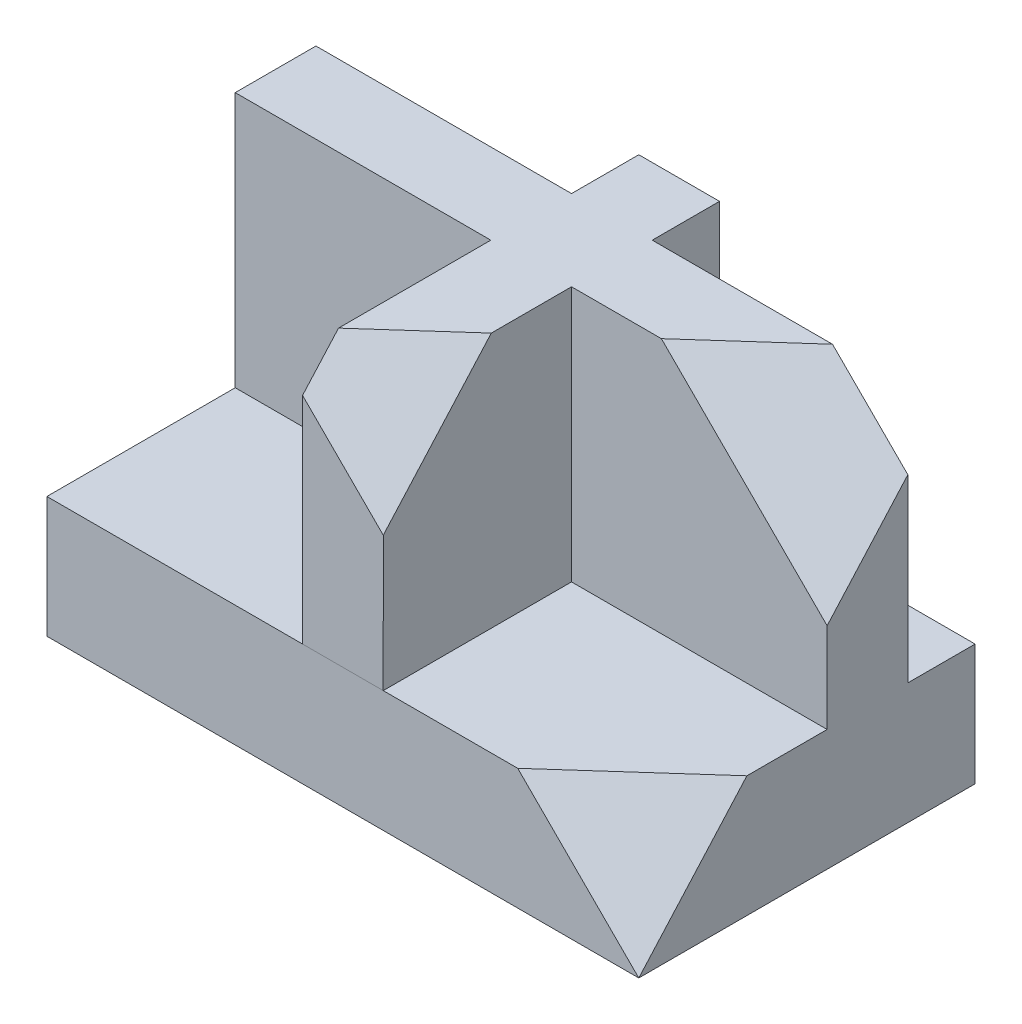
ISO-10303-21;
HEADER;
FILE_DESCRIPTION(('STEP AP214'),'2;1');
FILE_NAME('part.step','',(''),(''),'','','');
FILE_SCHEMA(('AUTOMOTIVE_DESIGN { 1 0 10303 214 1 1 1 1 }'));
ENDSEC;
DATA;
#1=APPLICATION_CONTEXT('core data for automotive mechanical design processes');
#2=APPLICATION_PROTOCOL_DEFINITION('international standard','automotive_design',2000,#1);
#3=PRODUCT_CONTEXT('',#1,'mechanical');
#4=PRODUCT('Part','Part','',(#3));
#5=PRODUCT_RELATED_PRODUCT_CATEGORY('part','',(#4));
#6=PRODUCT_DEFINITION_FORMATION('','',#4);
#7=PRODUCT_DEFINITION_CONTEXT('part definition',#1,'design');
#8=PRODUCT_DEFINITION('design','',#6,#7);
#9=PRODUCT_DEFINITION_SHAPE('','',#8);
#10=(LENGTH_UNIT() NAMED_UNIT(*) SI_UNIT(.MILLI.,.METRE.));
#11=(NAMED_UNIT(*) PLANE_ANGLE_UNIT() SI_UNIT($,.RADIAN.));
#12=(NAMED_UNIT(*) SI_UNIT($,.STERADIAN.) SOLID_ANGLE_UNIT());
#13=UNCERTAINTY_MEASURE_WITH_UNIT(LENGTH_MEASURE(1.E-05),#10,'distance_accuracy_value','');
#14=(GEOMETRIC_REPRESENTATION_CONTEXT(3) GLOBAL_UNCERTAINTY_ASSIGNED_CONTEXT((#13)) GLOBAL_UNIT_ASSIGNED_CONTEXT((#10,
#11,#12)) REPRESENTATION_CONTEXT('',''));
#15=CARTESIAN_POINT('',(0.,0.,0.));
#16=DIRECTION('',(0.,0.,1.));
#17=DIRECTION('',(1.,0.,0.));
#18=AXIS2_PLACEMENT_3D('',#15,#16,#17);
#19=CARTESIAN_POINT('',(0.,18.,0.));
#20=DIRECTION('',(0.,1.,0.));
#21=DIRECTION('',(0.,0.,1.));
#22=AXIS2_PLACEMENT_3D('',#19,#20,#21);
#23=PLANE('',#22);
#24=CARTESIAN_POINT('',(5.99999999999997,18.,25.));
#25=DIRECTION('',(1.,0.,0.));
#26=VECTOR('',#25,1.);
#27=LINE('',#24,#26);
#28=CARTESIAN_POINT('',(5.99999999999998,18.,24.9952309238108));
#29=VERTEX_POINT('',#28);
#30=CARTESIAN_POINT('',(25.9999999999998,18.,25.));
#31=VERTEX_POINT('',#30);
#32=EDGE_CURVE('E318',#29,#31,#27,.T.);
#33=ORIENTED_EDGE('',*,*,#32,.T.);
#34=DIRECTION('',(0.745937661625918,0.,-0.666015769308849));
#35=VECTOR('',#34,1.);
#36=CARTESIAN_POINT('',(23.9531582682752,18.,26.8275372604684));
#37=LINE('',#36,#35);
#38=CARTESIAN_POINT('',(44.,18.,8.92857142857144));
#39=VERTEX_POINT('',#38);
#40=EDGE_CURVE('E51',#31,#39,#37,.T.);
#41=ORIENTED_EDGE('',*,*,#40,.T.);
#42=DIRECTION('',(0.,0.,-1.));
#43=VECTOR('',#42,1.);
#44=CARTESIAN_POINT('',(44.,18.,-25.));
#45=LINE('',#44,#43);
#46=CARTESIAN_POINT('',(44.,18.,-3.));
#47=VERTEX_POINT('',#46);
#48=EDGE_CURVE('E37',#39,#47,#45,.T.);
#49=ORIENTED_EDGE('',*,*,#48,.T.);
#50=DIRECTION('',(1.,0.,0.));
#51=VECTOR('',#50,1.);
#52=CARTESIAN_POINT('',(5.99999999999998,18.,-3.));
#53=LINE('',#52,#51);
#54=CARTESIAN_POINT('',(5.99999999999998,18.,-3.));
#55=VERTEX_POINT('',#54);
#56=EDGE_CURVE('E211',#55,#47,#53,.T.);
#57=ORIENTED_EDGE('',*,*,#56,.F.);
#58=DIRECTION('',(0.,0.,-1.));
#59=VECTOR('',#58,1.);
#60=CARTESIAN_POINT('',(5.99999999999998,18.,-3.));
#61=LINE('',#60,#59);
#62=EDGE_CURVE('E215',#29,#55,#61,.T.);
#63=ORIENTED_EDGE('',*,*,#62,.F.);
#64=EDGE_LOOP('',(#33,#41,#49,#57,#63));
#65=FACE_BOUND('',#64,.T.);
#66=ADVANCED_FACE('F33',(#65),#23,.T.);
#67=CARTESIAN_POINT('',(44.,18.,-25.));
#68=DIRECTION('',(-1.,0.,0.));
#69=DIRECTION('',(0.,0.,1.));
#70=AXIS2_PLACEMENT_3D('',#67,#68,#69);
#71=PLANE('',#70);
#72=DIRECTION('',(0.,0.745937661625914,-0.666015769308853));
#73=VECTOR('',#72,1.);
#74=CARTESIAN_POINT('',(44.,34.8559261887864,-6.12136266855928));
#75=LINE('',#74,#73);
#76=CARTESIAN_POINT('',(44.,0.,25.));
#77=VERTEX_POINT('',#76);
#78=EDGE_CURVE('E404',#77,#39,#75,.T.);
#79=ORIENTED_EDGE('',*,*,#78,.F.);
#80=DIRECTION('',(0.,0.,-1.));
#81=VECTOR('',#80,1.);
#82=CARTESIAN_POINT('',(44.,0.,-25.));
#83=LINE('',#82,#81);
#84=CARTESIAN_POINT('',(44.,0.,-25.));
#85=VERTEX_POINT('',#84);
#86=EDGE_CURVE('E255',#77,#85,#83,.T.);
#87=ORIENTED_EDGE('',*,*,#86,.T.);
#88=DIRECTION('',(0.,-1.,0.));
#89=VECTOR('',#88,1.);
#90=CARTESIAN_POINT('',(44.,18.,-25.));
#91=LINE('',#90,#89);
#92=CARTESIAN_POINT('',(44.,18.,-25.));
#93=VERTEX_POINT('',#92);
#94=EDGE_CURVE('E171',#93,#85,#91,.T.);
#95=ORIENTED_EDGE('',*,*,#94,.F.);
#96=CARTESIAN_POINT('',(44.,18.,-15.));
#97=VERTEX_POINT('',#96);
#98=EDGE_CURVE('E382',#97,#93,#45,.T.);
#99=ORIENTED_EDGE('',*,*,#98,.F.);
#100=DIRECTION('',(0.,-1.,0.));
#101=VECTOR('',#100,1.);
#102=CARTESIAN_POINT('',(44.,56.,-15.));
#103=LINE('',#102,#101);
#104=CARTESIAN_POINT('',(44.,44.8,-15.));
#105=VERTEX_POINT('',#104);
#106=EDGE_CURVE('E241',#105,#97,#103,.T.);
#107=ORIENTED_EDGE('',*,*,#106,.F.);
#108=CARTESIAN_POINT('',(44.,31.36,-3.));
#109=VERTEX_POINT('',#108);
#110=EDGE_CURVE('E432',#109,#105,#75,.T.);
#111=ORIENTED_EDGE('',*,*,#110,.F.);
#112=DIRECTION('',(0.,-1.,0.));
#113=VECTOR('',#112,1.);
#114=CARTESIAN_POINT('',(44.,56.,-3.));
#115=LINE('',#114,#113);
#116=EDGE_CURVE('E243',#109,#47,#115,.T.);
#117=ORIENTED_EDGE('',*,*,#116,.T.);
#118=ORIENTED_EDGE('',*,*,#48,.F.);
#119=EDGE_LOOP('',(#79,#87,#95,#99,#107,#111,#117,#118));
#120=FACE_BOUND('',#119,.T.);
#121=ADVANCED_FACE('F35',(#120),#71,.F.);
#122=CARTESIAN_POINT('',(-44.,18.,25.));
#123=DIRECTION('',(0.,0.,-1.));
#124=DIRECTION('',(-1.,0.,0.));
#125=AXIS2_PLACEMENT_3D('',#122,#123,#124);
#126=PLANE('',#125);
#127=DIRECTION('',(0.707106781186551,-0.707106781186544,0.));
#128=VECTOR('',#127,1.);
#129=CARTESIAN_POINT('',(-9.00000000000047,52.9999999999999,25.));
#130=LINE('',#129,#128);
#131=EDGE_CURVE('E434',#31,#77,#130,.T.);
#132=ORIENTED_EDGE('',*,*,#131,.F.);
#133=ORIENTED_EDGE('',*,*,#32,.F.);
#134=CARTESIAN_POINT('',(-6.00000000000001,18.,24.9904618476217));
#135=DIRECTION('',(1.,0.,0.));
#136=VECTOR('',#135,1.);
#137=LINE('',#134,#136);
#138=CARTESIAN_POINT('',(-6.00000000000002,18.,24.9952309238108));
#139=VERTEX_POINT('',#138);
#140=EDGE_CURVE('E261',#139,#29,#137,.T.);
#141=ORIENTED_EDGE('',*,*,#140,.F.);
#142=CARTESIAN_POINT('',(-44.,18.,25.));
#143=DIRECTION('',(1.,0.,0.));
#144=VECTOR('',#143,1.);
#145=LINE('',#142,#144);
#146=CARTESIAN_POINT('',(-44.,18.,25.));
#147=VERTEX_POINT('',#146);
#148=EDGE_CURVE('E411',#147,#139,#145,.T.);
#149=ORIENTED_EDGE('',*,*,#148,.F.);
#150=DIRECTION('',(0.,-1.,0.));
#151=VECTOR('',#150,1.);
#152=CARTESIAN_POINT('',(-44.,18.,25.));
#153=LINE('',#152,#151);
#154=CARTESIAN_POINT('',(-44.,0.,25.));
#155=VERTEX_POINT('',#154);
#156=EDGE_CURVE('E396',#147,#155,#153,.T.);
#157=ORIENTED_EDGE('',*,*,#156,.T.);
#158=DIRECTION('',(1.,0.,0.));
#159=VECTOR('',#158,1.);
#160=CARTESIAN_POINT('',(-44.,0.,25.));
#161=LINE('',#160,#159);
#162=EDGE_CURVE('E393',#155,#77,#161,.T.);
#163=ORIENTED_EDGE('',*,*,#162,.T.);
#164=EDGE_LOOP('',(#132,#133,#141,#149,#157,#163));
#165=FACE_BOUND('',#164,.T.);
#166=ADVANCED_FACE('F281',(#165),#126,.F.);
#167=CARTESIAN_POINT('',(-6.00000000000001,56.,-3.));
#168=DIRECTION('',(1.,0.,0.));
#169=DIRECTION('',(0.,0.,-1.));
#170=AXIS2_PLACEMENT_3D('',#167,#168,#169);
#171=PLANE('',#170);
#172=DIRECTION('',(0.,-0.745937661625914,0.666015769308853));
#173=VECTOR('',#172,1.);
#174=CARTESIAN_POINT('',(-6.00000000000001,67.2491128459898,9.5990063875086));
#175=LINE('',#174,#173);
#176=CARTESIAN_POINT('',(-6.00000000000001,56.,19.6428571428567));
#177=VERTEX_POINT('',#176);
#178=CARTESIAN_POINT('',(-6.00000000000001,50.0106827306632,24.9904618476217));
#179=VERTEX_POINT('',#178);
#180=EDGE_CURVE('E164',#177,#179,#175,.T.);
#181=ORIENTED_EDGE('',*,*,#180,.F.);
#182=DIRECTION('',(0.,0.,1.));
#183=VECTOR('',#182,1.);
#184=CARTESIAN_POINT('',(-6.00000000000001,56.,-3.));
#185=LINE('',#184,#183);
#186=CARTESIAN_POINT('',(-6.00000000000001,56.,-3.));
#187=VERTEX_POINT('',#186);
#188=EDGE_CURVE('E177',#187,#177,#185,.T.);
#189=ORIENTED_EDGE('',*,*,#188,.F.);
#190=DIRECTION('',(0.,-1.,0.));
#191=VECTOR('',#190,1.);
#192=CARTESIAN_POINT('',(-6.00000000000001,56.,-3.));
#193=LINE('',#192,#191);
#194=CARTESIAN_POINT('',(-6.00000000000001,18.,-3.));
#195=VERTEX_POINT('',#194);
#196=EDGE_CURVE('E250',#187,#195,#193,.T.);
#197=ORIENTED_EDGE('',*,*,#196,.T.);
#198=DIRECTION('',(0.,0.,1.));
#199=VECTOR('',#198,1.);
#200=CARTESIAN_POINT('',(-6.00000000000001,18.,-3.));
#201=LINE('',#200,#199);
#202=EDGE_CURVE('E210',#195,#139,#201,.T.);
#203=ORIENTED_EDGE('',*,*,#202,.T.);
#204=DIRECTION('',(0.,-1.,0.));
#205=VECTOR('',#204,1.);
#206=CARTESIAN_POINT('',(-6.00000000000001,56.,24.9904618476217));
#207=LINE('',#206,#205);
#208=EDGE_CURVE('E179',#179,#139,#207,.T.);
#209=ORIENTED_EDGE('',*,*,#208,.F.);
#210=EDGE_LOOP('',(#181,#189,#197,#203,#209));
#211=FACE_BOUND('',#210,.T.);
#212=ADVANCED_FACE('F175',(#211),#171,.F.);
#213=CARTESIAN_POINT('',(5.99999999999999,56.,24.9904618476217));
#214=DIRECTION('',(0.,0.,-1.));
#215=DIRECTION('',(-1.,0.,0.));
#216=AXIS2_PLACEMENT_3D('',#213,#214,#215);
#217=PLANE('',#216);
#218=DIRECTION('',(0.707106781186551,-0.707106781186544,0.));
#219=VECTOR('',#218,1.);
#220=CARTESIAN_POINT('',(-2.99465863466833,47.0053413653316,24.9904618476217));
#221=LINE('',#220,#219);
#222=CARTESIAN_POINT('',(5.99999999999999,38.0106827306634,24.9904618476217));
#223=VERTEX_POINT('',#222);
#224=EDGE_CURVE('E180',#179,#223,#221,.T.);
#225=ORIENTED_EDGE('',*,*,#224,.F.);
#226=ORIENTED_EDGE('',*,*,#208,.T.);
#227=ORIENTED_EDGE('',*,*,#140,.T.);
#228=DIRECTION('',(0.,-1.,0.));
#229=VECTOR('',#228,1.);
#230=CARTESIAN_POINT('',(5.99999999999999,56.,24.9904618476217));
#231=LINE('',#230,#229);
#232=EDGE_CURVE('E249',#223,#29,#231,.T.);
#233=ORIENTED_EDGE('',*,*,#232,.F.);
#234=EDGE_LOOP('',(#225,#226,#227,#233));
#235=FACE_BOUND('',#234,.T.);
#236=ADVANCED_FACE('F267',(#235),#217,.F.);
#237=CARTESIAN_POINT('',(5.99999999999998,56.,-3.));
#238=DIRECTION('',(-1.,0.,0.));
#239=DIRECTION('',(0.,0.,1.));
#240=AXIS2_PLACEMENT_3D('',#237,#238,#239);
#241=PLANE('',#240);
#242=DIRECTION('',(0.,0.745937661625914,-0.666015769308853));
#243=VECTOR('',#242,1.);
#244=CARTESIAN_POINT('',(5.99999999999998,61.9261887863731,3.63733144073791));
#245=LINE('',#244,#243);
#246=CARTESIAN_POINT('',(5.99999999999998,56.,8.92857142857108));
#247=VERTEX_POINT('',#246);
#248=EDGE_CURVE('E167',#223,#247,#245,.T.);
#249=ORIENTED_EDGE('',*,*,#248,.F.);
#250=ORIENTED_EDGE('',*,*,#232,.T.);
#251=ORIENTED_EDGE('',*,*,#62,.T.);
#252=DIRECTION('',(0.,-1.,0.));
#253=VECTOR('',#252,1.);
#254=CARTESIAN_POINT('',(5.99999999999998,56.,-3.));
#255=LINE('',#254,#253);
#256=CARTESIAN_POINT('',(5.99999999999998,56.,-3.));
#257=VERTEX_POINT('',#256);
#258=EDGE_CURVE('E246',#257,#55,#255,.T.);
#259=ORIENTED_EDGE('',*,*,#258,.F.);
#260=DIRECTION('',(0.,0.,-1.));
#261=VECTOR('',#260,1.);
#262=CARTESIAN_POINT('',(5.99999999999998,56.,-3.));
#263=LINE('',#262,#261);
#264=EDGE_CURVE('E186',#247,#257,#263,.T.);
#265=ORIENTED_EDGE('',*,*,#264,.F.);
#266=EDGE_LOOP('',(#249,#250,#251,#259,#265));
#267=FACE_BOUND('',#266,.T.);
#268=ADVANCED_FACE('F277',(#267),#241,.F.);
#269=CARTESIAN_POINT('',(5.99999999999998,56.,-3.));
#270=DIRECTION('',(0.,0.,-1.));
#271=DIRECTION('',(-1.,0.,0.));
#272=AXIS2_PLACEMENT_3D('',#269,#270,#271);
#273=PLANE('',#272);
#274=DIRECTION('',(0.707106781186551,-0.707106781186544,0.));
#275=VECTOR('',#274,1.);
#276=CARTESIAN_POINT('',(12.6799999999998,62.6799999999999,-3.));
#277=LINE('',#276,#275);
#278=CARTESIAN_POINT('',(19.3599999999997,56.,-3.));
#279=VERTEX_POINT('',#278);
#280=EDGE_CURVE('E430',#279,#109,#277,.T.);
#281=ORIENTED_EDGE('',*,*,#280,.F.);
#282=DIRECTION('',(1.,0.,0.));
#283=VECTOR('',#282,1.);
#284=CARTESIAN_POINT('',(5.99999999999998,56.,-3.));
#285=LINE('',#284,#283);
#286=EDGE_CURVE('E188',#257,#279,#285,.T.);
#287=ORIENTED_EDGE('',*,*,#286,.F.);
#288=ORIENTED_EDGE('',*,*,#258,.T.);
#289=ORIENTED_EDGE('',*,*,#56,.T.);
#290=ORIENTED_EDGE('',*,*,#116,.F.);
#291=EDGE_LOOP('',(#281,#287,#288,#289,#290));
#292=FACE_BOUND('',#291,.T.);
#293=ADVANCED_FACE('F461',(#292),#273,.F.);
#294=CARTESIAN_POINT('',(5.99999999999998,56.,-15.));
#295=DIRECTION('',(0.,0.,1.));
#296=DIRECTION('',(1.,0.,0.));
#297=AXIS2_PLACEMENT_3D('',#294,#295,#296);
#298=PLANE('',#297);
#299=DIRECTION('',(-0.707106781186551,0.707106781186544,0.));
#300=VECTOR('',#299,1.);
#301=CARTESIAN_POINT('',(19.3999999999998,69.3999999999999,-15.));
#302=LINE('',#301,#300);
#303=CARTESIAN_POINT('',(32.7999999999999,56.,-15.));
#304=VERTEX_POINT('',#303);
#305=EDGE_CURVE('E58',#105,#304,#302,.T.);
#306=ORIENTED_EDGE('',*,*,#305,.F.);
#307=ORIENTED_EDGE('',*,*,#106,.T.);
#308=DIRECTION('',(-1.,0.,0.));
#309=VECTOR('',#308,1.);
#310=CARTESIAN_POINT('',(5.99999999999998,18.,-15.));
#311=LINE('',#310,#309);
#312=CARTESIAN_POINT('',(5.99999999999998,18.,-15.));
#313=VERTEX_POINT('',#312);
#314=EDGE_CURVE('E214',#97,#313,#311,.T.);
#315=ORIENTED_EDGE('',*,*,#314,.T.);
#316=DIRECTION('',(0.,-1.,0.));
#317=VECTOR('',#316,1.);
#318=CARTESIAN_POINT('',(5.99999999999998,56.,-15.));
#319=LINE('',#318,#317);
#320=CARTESIAN_POINT('',(5.99999999999998,56.,-15.));
#321=VERTEX_POINT('',#320);
#322=EDGE_CURVE('E238',#321,#313,#319,.T.);
#323=ORIENTED_EDGE('',*,*,#322,.F.);
#324=DIRECTION('',(-1.,0.,0.));
#325=VECTOR('',#324,1.);
#326=CARTESIAN_POINT('',(5.99999999999998,56.,-15.));
#327=LINE('',#326,#325);
#328=EDGE_CURVE('E196',#304,#321,#327,.T.);
#329=ORIENTED_EDGE('',*,*,#328,.F.);
#330=EDGE_LOOP('',(#306,#307,#315,#323,#329));
#331=FACE_BOUND('',#330,.T.);
#332=ADVANCED_FACE('F357',(#331),#298,.F.);
#333=CARTESIAN_POINT('',(0.,56.,0.));
#334=DIRECTION('',(0.,-1.,0.));
#335=DIRECTION('',(0.,0.,-1.));
#336=AXIS2_PLACEMENT_3D('',#333,#334,#335);
#337=PLANE('',#336);
#338=DIRECTION('',(-0.745937661625918,0.,0.666015769308849));
#339=VECTOR('',#338,1.);
#340=CARTESIAN_POINT('',(7.09723207948879,56.,7.94889992902752));
#341=LINE('',#340,#339);
#342=EDGE_CURVE('E11',#304,#279,#341,.T.);
#343=ORIENTED_EDGE('',*,*,#342,.F.);
#344=ORIENTED_EDGE('',*,*,#328,.T.);
#345=DIRECTION('',(0.,0.,-1.));
#346=VECTOR('',#345,1.);
#347=CARTESIAN_POINT('',(5.99999999999998,56.,-25.));
#348=LINE('',#347,#346);
#349=CARTESIAN_POINT('',(5.99999999999998,56.,-25.));
#350=VERTEX_POINT('',#349);
#351=EDGE_CURVE('E198',#321,#350,#348,.T.);
#352=ORIENTED_EDGE('',*,*,#351,.T.);
#353=DIRECTION('',(-1.,0.,0.));
#354=VECTOR('',#353,1.);
#355=CARTESIAN_POINT('',(5.99999999999998,56.,-25.));
#356=LINE('',#355,#354);
#357=CARTESIAN_POINT('',(-6.00000000000001,56.,-25.));
#358=VERTEX_POINT('',#357);
#359=EDGE_CURVE('E200',#350,#358,#356,.T.);
#360=ORIENTED_EDGE('',*,*,#359,.T.);
#361=DIRECTION('',(0.,0.,1.));
#362=VECTOR('',#361,1.);
#363=CARTESIAN_POINT('',(-6.00000000000001,56.,-25.));
#364=LINE('',#363,#362);
#365=CARTESIAN_POINT('',(-6.00000000000001,56.,-15.));
#366=VERTEX_POINT('',#365);
#367=EDGE_CURVE('E202',#358,#366,#364,.T.);
#368=ORIENTED_EDGE('',*,*,#367,.T.);
#369=DIRECTION('',(-1.,0.,0.));
#370=VECTOR('',#369,1.);
#371=CARTESIAN_POINT('',(-44.,56.,-15.));
#372=LINE('',#371,#370);
#373=CARTESIAN_POINT('',(-44.,56.,-15.));
#374=VERTEX_POINT('',#373);
#375=EDGE_CURVE('E204',#366,#374,#372,.T.);
#376=ORIENTED_EDGE('',*,*,#375,.T.);
#377=DIRECTION('',(0.,0.,1.));
#378=VECTOR('',#377,1.);
#379=CARTESIAN_POINT('',(-44.,56.,-3.));
#380=LINE('',#379,#378);
#381=CARTESIAN_POINT('',(-44.,56.,-3.));
#382=VERTEX_POINT('',#381);
#383=EDGE_CURVE('E190',#374,#382,#380,.T.);
#384=ORIENTED_EDGE('',*,*,#383,.T.);
#385=DIRECTION('',(1.,0.,0.));
#386=VECTOR('',#385,1.);
#387=CARTESIAN_POINT('',(-44.,56.,-3.));
#388=LINE('',#387,#386);
#389=EDGE_CURVE('E184',#382,#187,#388,.T.);
#390=ORIENTED_EDGE('',*,*,#389,.T.);
#391=ORIENTED_EDGE('',*,*,#188,.T.);
#392=EDGE_CURVE('E43',#247,#177,#341,.T.);
#393=ORIENTED_EDGE('',*,*,#392,.F.);
#394=ORIENTED_EDGE('',*,*,#264,.T.);
#395=ORIENTED_EDGE('',*,*,#286,.T.);
#396=EDGE_LOOP('',(#343,#344,#352,#360,#368,#376,#384,#390,#391,#393,#394,#395));
#397=FACE_BOUND('',#396,.T.);
#398=ADVANCED_FACE('F182',(#397),#337,.F.);
#399=DIRECTION('',(-1.,0.,0.));
#400=VECTOR('',#399,1.);
#401=CARTESIAN_POINT('',(-44.,18.,-15.));
#402=LINE('',#401,#400);
#403=CARTESIAN_POINT('',(-6.00000000000001,18.,-15.));
#404=VERTEX_POINT('',#403);
#405=CARTESIAN_POINT('',(-44.,18.,-15.));
#406=VERTEX_POINT('',#405);
#407=EDGE_CURVE('E224',#404,#406,#402,.T.);
#408=ORIENTED_EDGE('',*,*,#407,.F.);
#409=DIRECTION('',(0.,0.,1.));
#410=VECTOR('',#409,1.);
#411=CARTESIAN_POINT('',(-6.00000000000001,18.,-25.));
#412=LINE('',#411,#410);
#413=CARTESIAN_POINT('',(-6.00000000000001,18.,-25.));
#414=VERTEX_POINT('',#413);
#415=EDGE_CURVE('E221',#414,#404,#412,.T.);
#416=ORIENTED_EDGE('',*,*,#415,.F.);
#417=DIRECTION('',(-1.,0.,0.));
#418=VECTOR('',#417,1.);
#419=CARTESIAN_POINT('',(-44.,18.,-25.));
#420=LINE('',#419,#418);
#421=CARTESIAN_POINT('',(-44.,18.,-25.));
#422=VERTEX_POINT('',#421);
#423=EDGE_CURVE('E376',#414,#422,#420,.T.);
#424=ORIENTED_EDGE('',*,*,#423,.T.);
#425=DIRECTION('',(0.,0.,1.));
#426=VECTOR('',#425,1.);
#427=CARTESIAN_POINT('',(-44.,18.,-25.));
#428=LINE('',#427,#426);
#429=EDGE_CURVE('E325',#422,#406,#428,.T.);
#430=ORIENTED_EDGE('',*,*,#429,.T.);
#431=EDGE_LOOP('',(#408,#416,#424,#430));
#432=FACE_BOUND('',#431,.T.);
#433=ADVANCED_FACE('F345',(#432),#23,.T.);
#434=DIRECTION('',(0.,0.,-1.));
#435=VECTOR('',#434,1.);
#436=CARTESIAN_POINT('',(5.99999999999998,18.,-25.));
#437=LINE('',#436,#435);
#438=CARTESIAN_POINT('',(5.99999999999998,18.,-25.));
#439=VERTEX_POINT('',#438);
#440=EDGE_CURVE('E218',#313,#439,#437,.T.);
#441=ORIENTED_EDGE('',*,*,#440,.F.);
#442=ORIENTED_EDGE('',*,*,#314,.F.);
#443=ORIENTED_EDGE('',*,*,#98,.T.);
#444=EDGE_CURVE('E379',#93,#439,#420,.T.);
#445=ORIENTED_EDGE('',*,*,#444,.T.);
#446=EDGE_LOOP('',(#441,#442,#443,#445));
#447=FACE_BOUND('',#446,.T.);
#448=ADVANCED_FACE('F294',(#447),#23,.T.);
#449=CARTESIAN_POINT('',(-44.,18.,-25.));
#450=DIRECTION('',(0.,0.,1.));
#451=DIRECTION('',(1.,0.,0.));
#452=AXIS2_PLACEMENT_3D('',#449,#450,#451);
#453=PLANE('',#452);
#454=DIRECTION('',(-1.,0.,0.));
#455=VECTOR('',#454,1.);
#456=CARTESIAN_POINT('',(-44.,0.,-25.));
#457=LINE('',#456,#455);
#458=CARTESIAN_POINT('',(-44.,0.,-25.));
#459=VERTEX_POINT('',#458);
#460=EDGE_CURVE('E389',#85,#459,#457,.T.);
#461=ORIENTED_EDGE('',*,*,#460,.T.);
#462=DIRECTION('',(0.,-1.,0.));
#463=VECTOR('',#462,1.);
#464=CARTESIAN_POINT('',(-44.,18.,-25.));
#465=LINE('',#464,#463);
#466=EDGE_CURVE('E378',#422,#459,#465,.T.);
#467=ORIENTED_EDGE('',*,*,#466,.F.);
#468=ORIENTED_EDGE('',*,*,#423,.F.);
#469=DIRECTION('',(0.,-1.,0.));
#470=VECTOR('',#469,1.);
#471=CARTESIAN_POINT('',(-6.00000000000001,56.,-25.));
#472=LINE('',#471,#470);
#473=EDGE_CURVE('E232',#358,#414,#472,.T.);
#474=ORIENTED_EDGE('',*,*,#473,.F.);
#475=ORIENTED_EDGE('',*,*,#359,.F.);
#476=DIRECTION('',(0.,-1.,0.));
#477=VECTOR('',#476,1.);
#478=CARTESIAN_POINT('',(5.99999999999998,56.,-25.));
#479=LINE('',#478,#477);
#480=EDGE_CURVE('E235',#350,#439,#479,.T.);
#481=ORIENTED_EDGE('',*,*,#480,.T.);
#482=ORIENTED_EDGE('',*,*,#444,.F.);
#483=ORIENTED_EDGE('',*,*,#94,.T.);
#484=EDGE_LOOP('',(#461,#467,#468,#474,#475,#481,#482,#483));
#485=FACE_BOUND('',#484,.T.);
#486=ADVANCED_FACE('F338',(#485),#453,.F.);
#487=CARTESIAN_POINT('',(-44.,18.,-25.));
#488=DIRECTION('',(1.,0.,0.));
#489=DIRECTION('',(0.,0.,-1.));
#490=AXIS2_PLACEMENT_3D('',#487,#488,#489);
#491=PLANE('',#490);
#492=DIRECTION('',(0.,0.,1.));
#493=VECTOR('',#492,1.);
#494=CARTESIAN_POINT('',(-44.,0.,-25.));
#495=LINE('',#494,#493);
#496=EDGE_CURVE('E391',#459,#155,#495,.T.);
#497=ORIENTED_EDGE('',*,*,#496,.T.);
#498=ORIENTED_EDGE('',*,*,#156,.F.);
#499=CARTESIAN_POINT('',(-44.,18.,-3.));
#500=VERTEX_POINT('',#499);
#501=EDGE_CURVE('E381',#500,#147,#428,.T.);
#502=ORIENTED_EDGE('',*,*,#501,.F.);
#503=DIRECTION('',(0.,-1.,0.));
#504=VECTOR('',#503,1.);
#505=CARTESIAN_POINT('',(-44.,56.,-3.));
#506=LINE('',#505,#504);
#507=EDGE_CURVE('E252',#382,#500,#506,.T.);
#508=ORIENTED_EDGE('',*,*,#507,.F.);
#509=ORIENTED_EDGE('',*,*,#383,.F.);
#510=DIRECTION('',(0.,-1.,0.));
#511=VECTOR('',#510,1.);
#512=CARTESIAN_POINT('',(-44.,56.,-15.));
#513=LINE('',#512,#511);
#514=EDGE_CURVE('E206',#374,#406,#513,.T.);
#515=ORIENTED_EDGE('',*,*,#514,.T.);
#516=ORIENTED_EDGE('',*,*,#429,.F.);
#517=ORIENTED_EDGE('',*,*,#466,.T.);
#518=EDGE_LOOP('',(#497,#498,#502,#508,#509,#515,#516,#517));
#519=FACE_BOUND('',#518,.T.);
#520=ADVANCED_FACE('F292',(#519),#491,.F.);
#521=ORIENTED_EDGE('',*,*,#202,.F.);
#522=DIRECTION('',(1.,0.,0.));
#523=VECTOR('',#522,1.);
#524=CARTESIAN_POINT('',(-44.,18.,-3.));
#525=LINE('',#524,#523);
#526=EDGE_CURVE('E207',#500,#195,#525,.T.);
#527=ORIENTED_EDGE('',*,*,#526,.F.);
#528=ORIENTED_EDGE('',*,*,#501,.T.);
#529=ORIENTED_EDGE('',*,*,#148,.T.);
#530=EDGE_LOOP('',(#521,#527,#528,#529));
#531=FACE_BOUND('',#530,.T.);
#532=ADVANCED_FACE('F288',(#531),#23,.T.);
#533=CARTESIAN_POINT('',(0.,0.,0.));
#534=DIRECTION('',(0.,1.,0.));
#535=DIRECTION('',(0.,0.,1.));
#536=AXIS2_PLACEMENT_3D('',#533,#534,#535);
#537=PLANE('',#536);
#538=ORIENTED_EDGE('',*,*,#86,.F.);
#539=ORIENTED_EDGE('',*,*,#162,.F.);
#540=ORIENTED_EDGE('',*,*,#496,.F.);
#541=ORIENTED_EDGE('',*,*,#460,.F.);
#542=EDGE_LOOP('',(#538,#539,#540,#541));
#543=FACE_BOUND('',#542,.T.);
#544=ADVANCED_FACE('F286',(#543),#537,.F.);
#545=CARTESIAN_POINT('',(-44.,56.,-3.));
#546=DIRECTION('',(0.,0.,-1.));
#547=DIRECTION('',(-1.,0.,0.));
#548=AXIS2_PLACEMENT_3D('',#545,#546,#547);
#549=PLANE('',#548);
#550=ORIENTED_EDGE('',*,*,#526,.T.);
#551=ORIENTED_EDGE('',*,*,#196,.F.);
#552=ORIENTED_EDGE('',*,*,#389,.F.);
#553=ORIENTED_EDGE('',*,*,#507,.T.);
#554=EDGE_LOOP('',(#550,#551,#552,#553));
#555=FACE_BOUND('',#554,.T.);
#556=ADVANCED_FACE('F282',(#555),#549,.F.);
#557=CARTESIAN_POINT('',(5.99999999999998,56.,-25.));
#558=DIRECTION('',(-1.,0.,0.));
#559=DIRECTION('',(0.,0.,1.));
#560=AXIS2_PLACEMENT_3D('',#557,#558,#559);
#561=PLANE('',#560);
#562=ORIENTED_EDGE('',*,*,#440,.T.);
#563=ORIENTED_EDGE('',*,*,#480,.F.);
#564=ORIENTED_EDGE('',*,*,#351,.F.);
#565=ORIENTED_EDGE('',*,*,#322,.T.);
#566=EDGE_LOOP('',(#562,#563,#564,#565));
#567=FACE_BOUND('',#566,.T.);
#568=ADVANCED_FACE('F285',(#567),#561,.F.);
#569=CARTESIAN_POINT('',(-6.00000000000001,56.,-25.));
#570=DIRECTION('',(1.,0.,0.));
#571=DIRECTION('',(0.,0.,-1.));
#572=AXIS2_PLACEMENT_3D('',#569,#570,#571);
#573=PLANE('',#572);
#574=ORIENTED_EDGE('',*,*,#415,.T.);
#575=DIRECTION('',(0.,-1.,0.));
#576=VECTOR('',#575,1.);
#577=CARTESIAN_POINT('',(-6.00000000000001,56.,-15.));
#578=LINE('',#577,#576);
#579=EDGE_CURVE('E229',#366,#404,#578,.T.);
#580=ORIENTED_EDGE('',*,*,#579,.F.);
#581=ORIENTED_EDGE('',*,*,#367,.F.);
#582=ORIENTED_EDGE('',*,*,#473,.T.);
#583=EDGE_LOOP('',(#574,#580,#581,#582));
#584=FACE_BOUND('',#583,.T.);
#585=ADVANCED_FACE('F365',(#584),#573,.F.);
#586=CARTESIAN_POINT('',(-44.,56.,-15.));
#587=DIRECTION('',(0.,0.,1.));
#588=DIRECTION('',(1.,0.,0.));
#589=AXIS2_PLACEMENT_3D('',#586,#587,#588);
#590=PLANE('',#589);
#591=ORIENTED_EDGE('',*,*,#407,.T.);
#592=ORIENTED_EDGE('',*,*,#514,.F.);
#593=ORIENTED_EDGE('',*,*,#375,.F.);
#594=ORIENTED_EDGE('',*,*,#579,.T.);
#595=EDGE_LOOP('',(#591,#592,#593,#594));
#596=FACE_BOUND('',#595,.T.);
#597=ADVANCED_FACE('F369',(#596),#590,.F.);
#598=CARTESIAN_POINT('',(22.1238938053095,22.1238938053098,24.7787610619469));
#599=DIRECTION('',(0.554325087698112,0.554325087698118,0.620844098221892));
#600=DIRECTION('',(0.,-0.745937661625914,0.666015769308853));
#601=AXIS2_PLACEMENT_3D('',#598,#599,#600);
#602=PLANE('',#601);
#603=ORIENTED_EDGE('',*,*,#180,.T.);
#604=ORIENTED_EDGE('',*,*,#224,.T.);
#605=ORIENTED_EDGE('',*,*,#248,.T.);
#606=ORIENTED_EDGE('',*,*,#392,.T.);
#607=EDGE_LOOP('',(#603,#604,#605,#606));
#608=FACE_BOUND('',#607,.T.);
#609=ADVANCED_FACE('F163',(#608),#602,.T.);
#610=ORIENTED_EDGE('',*,*,#110,.T.);
#611=ORIENTED_EDGE('',*,*,#305,.T.);
#612=ORIENTED_EDGE('',*,*,#342,.T.);
#613=ORIENTED_EDGE('',*,*,#280,.T.);
#614=EDGE_LOOP('',(#610,#611,#612,#613));
#615=FACE_BOUND('',#614,.T.);
#616=ADVANCED_FACE('F442',(#615),#602,.T.);
#617=ORIENTED_EDGE('',*,*,#131,.T.);
#618=ORIENTED_EDGE('',*,*,#78,.T.);
#619=ORIENTED_EDGE('',*,*,#40,.F.);
#620=EDGE_LOOP('',(#617,#618,#619));
#621=FACE_BOUND('',#620,.T.);
#622=ADVANCED_FACE('F440',(#621),#602,.T.);
#623=CLOSED_SHELL('',(#66,#121,#166,#212,#236,#268,#293,#332,#398,#433,#448,#486,#520,#532,#544,
#556,#568,#585,#597,#609,#616,#622));
#624=MANIFOLD_SOLID_BREP('B2',#623);
#625=ADVANCED_BREP_SHAPE_REPRESENTATION('',(#18,#624),#14);
#626=SHAPE_DEFINITION_REPRESENTATION(#9,#625);
ENDSEC;
END-ISO-10303-21;
